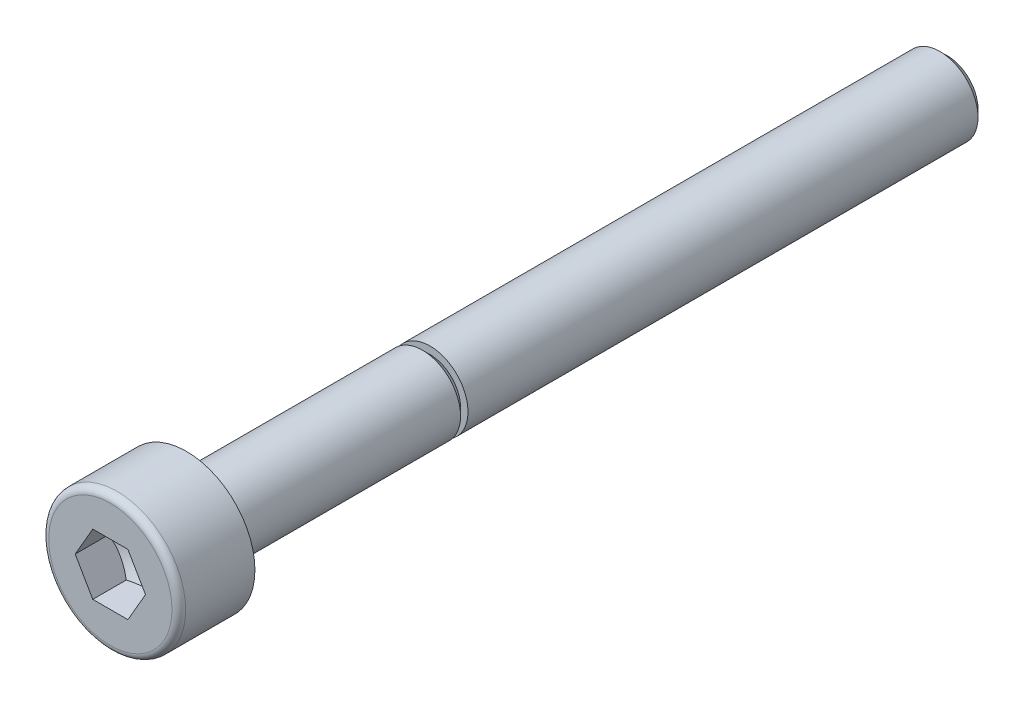
ISO-10303-21;
HEADER;
FILE_DESCRIPTION(('STEP AP214'),'2;1');
FILE_NAME('part.step','',(''),(''),'','','');
FILE_SCHEMA(('AUTOMOTIVE_DESIGN { 1 0 10303 214 1 1 1 1 }'));
ENDSEC;
DATA;
#1=APPLICATION_CONTEXT('core data for automotive mechanical design processes');
#2=APPLICATION_PROTOCOL_DEFINITION('international standard','automotive_design',2000,#1);
#3=PRODUCT_CONTEXT('',#1,'mechanical');
#4=PRODUCT('Part','Part','',(#3));
#5=PRODUCT_RELATED_PRODUCT_CATEGORY('part','',(#4));
#6=PRODUCT_DEFINITION_FORMATION('','',#4);
#7=PRODUCT_DEFINITION_CONTEXT('part definition',#1,'design');
#8=PRODUCT_DEFINITION('design','',#6,#7);
#9=PRODUCT_DEFINITION_SHAPE('','',#8);
#10=(LENGTH_UNIT() NAMED_UNIT(*) SI_UNIT(.MILLI.,.METRE.));
#11=(NAMED_UNIT(*) PLANE_ANGLE_UNIT() SI_UNIT($,.RADIAN.));
#12=(NAMED_UNIT(*) SI_UNIT($,.STERADIAN.) SOLID_ANGLE_UNIT());
#13=UNCERTAINTY_MEASURE_WITH_UNIT(LENGTH_MEASURE(1.E-05),#10,'distance_accuracy_value','');
#14=(GEOMETRIC_REPRESENTATION_CONTEXT(3) GLOBAL_UNCERTAINTY_ASSIGNED_CONTEXT((#13)) GLOBAL_UNIT_ASSIGNED_CONTEXT((#10,
#11,#12)) REPRESENTATION_CONTEXT('',''));
#15=CARTESIAN_POINT('',(0.,0.,0.));
#16=DIRECTION('',(0.,0.,1.));
#17=DIRECTION('',(1.,0.,0.));
#18=AXIS2_PLACEMENT_3D('',#15,#16,#17);
#19=CARTESIAN_POINT('',(0.,2.025,2.5));
#20=DIRECTION('',(0.,0.,-1.));
#21=DIRECTION('',(-1.,0.,0.));
#22=AXIS2_PLACEMENT_3D('',#19,#20,#21);
#23=PLANE('',#22);
#24=CARTESIAN_POINT('',(0.,0.,2.5));
#25=DIRECTION('',(0.,0.,1.));
#26=DIRECTION('',(1.,0.,0.));
#27=AXIS2_PLACEMENT_3D('',#24,#25,#26);
#28=CIRCLE('',#27,2.025);
#29=CARTESIAN_POINT('',(2.025,0.,2.5));
#30=VERTEX_POINT('',#29);
#31=EDGE_CURVE('E137',#30,#30,#28,.T.);
#32=ORIENTED_EDGE('',*,*,#31,.T.);
#33=EDGE_LOOP('',(#32));
#34=FACE_BOUND('',#33,.T.);
#35=DIRECTION('',(0.5,-0.866025403784439,0.));
#36=VECTOR('',#35,1.);
#37=CARTESIAN_POINT('',(0.57735,0.999999533749892,2.5));
#38=LINE('',#37,#36);
#39=CARTESIAN_POINT('',(0.57735,0.999999533749892,2.5));
#40=VERTEX_POINT('',#39);
#41=CARTESIAN_POINT('',(1.1547,0.,2.5));
#42=VERTEX_POINT('',#41);
#43=EDGE_CURVE('E31',#40,#42,#38,.T.);
#44=ORIENTED_EDGE('',*,*,#43,.T.);
#45=DIRECTION('',(-0.5,-0.866025403784439,0.));
#46=VECTOR('',#45,1.);
#47=CARTESIAN_POINT('',(1.1547,0.,2.5));
#48=LINE('',#47,#46);
#49=CARTESIAN_POINT('',(0.57735,-0.999999533749891,2.5));
#50=VERTEX_POINT('',#49);
#51=EDGE_CURVE('E184',#42,#50,#48,.T.);
#52=ORIENTED_EDGE('',*,*,#51,.T.);
#53=DIRECTION('',(-1.,0.,0.));
#54=VECTOR('',#53,1.);
#55=CARTESIAN_POINT('',(0.57735,-0.999999533749891,2.5));
#56=LINE('',#55,#54);
#57=CARTESIAN_POINT('',(-0.57735,-0.999999533749892,2.5));
#58=VERTEX_POINT('',#57);
#59=EDGE_CURVE('E189',#50,#58,#56,.T.);
#60=ORIENTED_EDGE('',*,*,#59,.T.);
#61=DIRECTION('',(-0.5,0.866025403784439,0.));
#62=VECTOR('',#61,1.);
#63=CARTESIAN_POINT('',(-0.57735,-0.999999533749892,2.5));
#64=LINE('',#63,#62);
#65=CARTESIAN_POINT('',(-1.1547,0.,2.5));
#66=VERTEX_POINT('',#65);
#67=EDGE_CURVE('E193',#58,#66,#64,.T.);
#68=ORIENTED_EDGE('',*,*,#67,.T.);
#69=DIRECTION('',(0.5,0.866025403784439,0.));
#70=VECTOR('',#69,1.);
#71=CARTESIAN_POINT('',(-1.1547,0.,2.5));
#72=LINE('',#71,#70);
#73=CARTESIAN_POINT('',(-0.57735,0.999999533749891,2.5));
#74=VERTEX_POINT('',#73);
#75=EDGE_CURVE('E103',#66,#74,#72,.T.);
#76=ORIENTED_EDGE('',*,*,#75,.T.);
#77=DIRECTION('',(1.,0.,0.));
#78=VECTOR('',#77,1.);
#79=CARTESIAN_POINT('',(-0.57735,0.999999533749891,2.5));
#80=LINE('',#79,#78);
#81=EDGE_CURVE('E94',#74,#40,#80,.T.);
#82=ORIENTED_EDGE('',*,*,#81,.T.);
#83=EDGE_LOOP('',(#44,#52,#60,#68,#76,#82));
#84=FACE_BOUND('',#83,.T.);
#85=ADVANCED_FACE('F16',(#34,#84),#23,.F.);
#86=CARTESIAN_POINT('',(0.,0.,0.));
#87=DIRECTION('',(0.,0.,1.));
#88=DIRECTION('',(1.,0.,0.));
#89=AXIS2_PLACEMENT_3D('',#86,#87,#88);
#90=PLANE('',#89);
#91=CARTESIAN_POINT('',(0.,0.,0.));
#92=DIRECTION('',(0.,0.,1.));
#93=DIRECTION('',(1.,0.,0.));
#94=AXIS2_PLACEMENT_3D('',#91,#92,#93);
#95=CIRCLE('',#94,2.25);
#96=CARTESIAN_POINT('',(2.25,0.,0.));
#97=VERTEX_POINT('',#96);
#98=EDGE_CURVE('E24',#97,#97,#95,.T.);
#99=ORIENTED_EDGE('',*,*,#98,.F.);
#100=EDGE_LOOP('',(#99));
#101=FACE_BOUND('',#100,.T.);
#102=CARTESIAN_POINT('',(0.,0.,0.));
#103=DIRECTION('',(0.,0.,1.));
#104=DIRECTION('',(1.,0.,0.));
#105=AXIS2_PLACEMENT_3D('',#102,#103,#104);
#106=CIRCLE('',#105,1.25);
#107=CARTESIAN_POINT('',(1.25,0.,0.));
#108=VERTEX_POINT('',#107);
#109=EDGE_CURVE('E11',#108,#108,#106,.F.);
#110=ORIENTED_EDGE('',*,*,#109,.F.);
#111=EDGE_LOOP('',(#110));
#112=FACE_BOUND('',#111,.T.);
#113=ADVANCED_FACE('F152',(#101,#112),#90,.F.);
#114=CARTESIAN_POINT('',(0.,0.,2.5));
#115=DIRECTION('',(0.,0.,1.));
#116=DIRECTION('',(1.,0.,0.));
#117=AXIS2_PLACEMENT_3D('',#114,#115,#116);
#118=CYLINDRICAL_SURFACE('',#117,2.25);
#119=CARTESIAN_POINT('',(0.,0.,2.275));
#120=DIRECTION('',(0.,0.,1.));
#121=DIRECTION('',(1.,0.,0.));
#122=AXIS2_PLACEMENT_3D('',#119,#120,#121);
#123=CIRCLE('',#122,2.25);
#124=CARTESIAN_POINT('',(2.25,0.,2.275));
#125=VERTEX_POINT('',#124);
#126=EDGE_CURVE('E141',#125,#125,#123,.T.);
#127=ORIENTED_EDGE('',*,*,#126,.F.);
#128=EDGE_LOOP('',(#127));
#129=FACE_BOUND('',#128,.T.);
#130=ORIENTED_EDGE('',*,*,#98,.T.);
#131=EDGE_LOOP('',(#130));
#132=FACE_BOUND('',#131,.T.);
#133=ADVANCED_FACE('F150',(#129,#132),#118,.T.);
#134=CARTESIAN_POINT('',(0.,0.,2.275));
#135=DIRECTION('',(0.,0.,1.));
#136=DIRECTION('',(1.,0.,0.));
#137=AXIS2_PLACEMENT_3D('',#134,#135,#136);
#138=TOROIDAL_SURFACE('',#137,2.025,0.225);
#139=ORIENTED_EDGE('',*,*,#31,.F.);
#140=EDGE_LOOP('',(#139));
#141=FACE_BOUND('',#140,.T.);
#142=ORIENTED_EDGE('',*,*,#126,.T.);
#143=EDGE_LOOP('',(#142));
#144=FACE_BOUND('',#143,.T.);
#145=ADVANCED_FACE('F160',(#141,#144),#138,.T.);
#146=CARTESIAN_POINT('',(0.,0.,0.));
#147=DIRECTION('',(0.,0.,1.));
#148=DIRECTION('',(1.,0.,0.));
#149=AXIS2_PLACEMENT_3D('',#146,#147,#148);
#150=CYLINDRICAL_SURFACE('',#149,1.25);
#151=CARTESIAN_POINT('',(0.,0.,-7.7564375));
#152=DIRECTION('',(0.,0.,1.));
#153=DIRECTION('',(1.,0.,0.));
#154=AXIS2_PLACEMENT_3D('',#151,#152,#153);
#155=CIRCLE('',#154,1.25);
#156=CARTESIAN_POINT('',(1.25,0.,-7.7564375));
#157=VERTEX_POINT('',#156);
#158=EDGE_CURVE('E117',#157,#157,#155,.T.);
#159=ORIENTED_EDGE('',*,*,#158,.T.);
#160=EDGE_LOOP('',(#159));
#161=FACE_BOUND('',#160,.T.);
#162=ORIENTED_EDGE('',*,*,#109,.T.);
#163=EDGE_LOOP('',(#162));
#164=FACE_BOUND('',#163,.T.);
#165=ADVANCED_FACE('F157',(#161,#164),#150,.T.);
#166=CARTESIAN_POINT('',(0.,0.,-25.));
#167=DIRECTION('',(0.,0.,1.));
#168=DIRECTION('',(1.,0.,0.));
#169=AXIS2_PLACEMENT_3D('',#166,#167,#168);
#170=PLANE('',#169);
#171=CARTESIAN_POINT('',(0.,0.,-25.));
#172=DIRECTION('',(0.,0.,1.));
#173=DIRECTION('',(1.,0.,0.));
#174=AXIS2_PLACEMENT_3D('',#171,#172,#173);
#175=CIRCLE('',#174,1.0064375);
#176=CARTESIAN_POINT('',(1.0064375,0.,-25.));
#177=VERTEX_POINT('',#176);
#178=EDGE_CURVE('E133',#177,#177,#175,.T.);
#179=ORIENTED_EDGE('',*,*,#178,.F.);
#180=EDGE_LOOP('',(#179));
#181=FACE_BOUND('',#180,.T.);
#182=ADVANCED_FACE('F159',(#181),#170,.F.);
#183=CARTESIAN_POINT('',(0.,0.,-25.));
#184=DIRECTION('',(0.,0.,1.));
#185=DIRECTION('',(1.,0.,0.));
#186=AXIS2_PLACEMENT_3D('',#183,#184,#185);
#187=CONICAL_SURFACE('',#186,1.0064375,0.78539816339745);
#188=CARTESIAN_POINT('',(0.,0.,-24.7564375));
#189=DIRECTION('',(0.,0.,1.));
#190=DIRECTION('',(1.,0.,0.));
#191=AXIS2_PLACEMENT_3D('',#188,#189,#190);
#192=CIRCLE('',#191,1.25);
#193=CARTESIAN_POINT('',(1.25,0.,-24.7564375));
#194=VERTEX_POINT('',#193);
#195=EDGE_CURVE('E129',#194,#194,#192,.T.);
#196=ORIENTED_EDGE('',*,*,#195,.F.);
#197=EDGE_LOOP('',(#196));
#198=FACE_BOUND('',#197,.T.);
#199=ORIENTED_EDGE('',*,*,#178,.T.);
#200=EDGE_LOOP('',(#199));
#201=FACE_BOUND('',#200,.T.);
#202=ADVANCED_FACE('F168',(#198,#201),#187,.T.);
#203=CARTESIAN_POINT('',(0.,0.,0.));
#204=DIRECTION('',(0.,0.,1.));
#205=DIRECTION('',(1.,0.,0.));
#206=AXIS2_PLACEMENT_3D('',#203,#204,#205);
#207=CYLINDRICAL_SURFACE('',#206,1.25);
#208=CARTESIAN_POINT('',(0.,0.,-8.));
#209=DIRECTION('',(0.,0.,1.));
#210=DIRECTION('',(1.,0.,0.));
#211=AXIS2_PLACEMENT_3D('',#208,#209,#210);
#212=CIRCLE('',#211,1.25);
#213=CARTESIAN_POINT('',(1.25,0.,-8.));
#214=VERTEX_POINT('',#213);
#215=EDGE_CURVE('E125',#214,#214,#212,.T.);
#216=ORIENTED_EDGE('',*,*,#215,.F.);
#217=EDGE_LOOP('',(#216));
#218=FACE_BOUND('',#217,.T.);
#219=ORIENTED_EDGE('',*,*,#195,.T.);
#220=EDGE_LOOP('',(#219));
#221=FACE_BOUND('',#220,.T.);
#222=ADVANCED_FACE('F329',(#218,#221),#207,.T.);
#223=CARTESIAN_POINT('',(0.,1.25,-8.));
#224=DIRECTION('',(0.,0.,-1.));
#225=DIRECTION('',(-1.,0.,0.));
#226=AXIS2_PLACEMENT_3D('',#223,#224,#225);
#227=PLANE('',#226);
#228=CARTESIAN_POINT('',(0.,0.,-8.));
#229=DIRECTION('',(0.,0.,1.));
#230=DIRECTION('',(1.,0.,0.));
#231=AXIS2_PLACEMENT_3D('',#228,#229,#230);
#232=CIRCLE('',#231,1.0064375);
#233=CARTESIAN_POINT('',(1.0064375,0.,-8.));
#234=VERTEX_POINT('',#233);
#235=EDGE_CURVE('E121',#234,#234,#232,.T.);
#236=ORIENTED_EDGE('',*,*,#235,.F.);
#237=EDGE_LOOP('',(#236));
#238=FACE_BOUND('',#237,.T.);
#239=ORIENTED_EDGE('',*,*,#215,.T.);
#240=EDGE_LOOP('',(#239));
#241=FACE_BOUND('',#240,.T.);
#242=ADVANCED_FACE('F321',(#238,#241),#227,.F.);
#243=CARTESIAN_POINT('',(0.,0.,-8.));
#244=DIRECTION('',(0.,0.,1.));
#245=DIRECTION('',(1.,0.,0.));
#246=AXIS2_PLACEMENT_3D('',#243,#244,#245);
#247=CONICAL_SURFACE('',#246,1.0064375,0.785398163397449);
#248=ORIENTED_EDGE('',*,*,#158,.F.);
#249=EDGE_LOOP('',(#248));
#250=FACE_BOUND('',#249,.T.);
#251=ORIENTED_EDGE('',*,*,#235,.T.);
#252=EDGE_LOOP('',(#251));
#253=FACE_BOUND('',#252,.T.);
#254=ADVANCED_FACE('F314',(#250,#253),#247,.T.);
#255=CARTESIAN_POINT('',(0.57735,0.999999533749892,0.733333644166739));
#256=DIRECTION('',(-0.866025403784439,-0.5,0.));
#257=DIRECTION('',(-0.5,0.866025403784439,0.));
#258=AXIS2_PLACEMENT_3D('',#255,#256,#257);
#259=PLANE('',#258);
#260=DIRECTION('',(0.,0.,1.));
#261=VECTOR('',#260,1.);
#262=CARTESIAN_POINT('',(1.1547,0.,0.733333644166739));
#263=LINE('',#262,#261);
#264=CARTESIAN_POINT('',(1.1547,0.,1.4));
#265=VERTEX_POINT('',#264);
#266=EDGE_CURVE('E115',#265,#42,#263,.T.);
#267=ORIENTED_EDGE('',*,*,#266,.T.);
#268=ORIENTED_EDGE('',*,*,#43,.F.);
#269=DIRECTION('',(0.,0.,1.));
#270=VECTOR('',#269,1.);
#271=CARTESIAN_POINT('',(0.57735,0.999999533749892,0.733333644166739));
#272=LINE('',#271,#270);
#273=CARTESIAN_POINT('',(0.57735,0.999999533749892,1.4));
#274=VERTEX_POINT('',#273);
#275=EDGE_CURVE('E87',#274,#40,#272,.T.);
#276=ORIENTED_EDGE('',*,*,#275,.F.);
#277=CARTESIAN_POINT('',(1.15470115470054,-2.E-06,1.40000066666767));
#278=CARTESIAN_POINT('',(1.12933009927234,0.0439419570432812,1.38534839130548));
#279=CARTESIAN_POINT('',(1.10374004129754,0.088265237624272,1.37202290534354));
#280=CARTESIAN_POINT('',(1.05211684902319,0.17767922949234,1.34876365062444));
#281=CARTESIAN_POINT('',(1.02608279776624,0.22277152899623,1.33883810924503));
#282=CARTESIAN_POINT('',(0.974337322784001,0.312397320727257,1.32338826224283));
#283=CARTESIAN_POINT('',(0.948633858612371,0.356917026603045,1.31776111778143));
#284=CARTESIAN_POINT('',(0.897106047785879,0.446165812957328,1.31104469248615));
#285=CARTESIAN_POINT('',(0.871281888296732,0.490894569255293,1.30994984858515));
#286=CARTESIAN_POINT('',(0.823032064442526,0.574465715627026,1.31223310501152));
#287=CARTESIAN_POINT('',(0.800599160429648,0.613320645138646,1.3150505901439));
#288=CARTESIAN_POINT('',(0.755879495715112,0.690777376521668,1.32397862379728));
#289=CARTESIAN_POINT('',(0.733592889575673,0.729378910683452,1.33009221924117));
#290=CARTESIAN_POINT('',(0.688781095362013,0.806995215039832,1.34537505021915));
#291=CARTESIAN_POINT('',(0.666261576071427,0.846000166613155,1.3546090395603));
#292=CARTESIAN_POINT('',(0.621558322302024,0.923428473405406,1.3755663014077));
#293=CARTESIAN_POINT('',(0.599374015548132,0.961852819833839,1.38728465283382));
#294=CARTESIAN_POINT('',(0.577348845299461,1.00000153374989,1.40000066666767));
#295=B_SPLINE_CURVE_WITH_KNOTS('',3,(#277,#278,#279,#280,#281,#282,#283,#284,#285,#286,#287,
#288,#289,#290,#291,#292,#293,#294),.UNSPECIFIED.,.F.,.F.,(4,2,2,2,2,2,2,2,4),(0.,
0.158508089994533,0.317397081098293,0.472354046423629,0.627120756921706,0.76185516297255,
0.896714331530991,1.0345640617321,1.17214324556804),.UNSPECIFIED.);
#296=EDGE_CURVE('E79',#265,#274,#295,.T.);
#297=ORIENTED_EDGE('',*,*,#296,.F.);
#298=EDGE_LOOP('',(#267,#268,#276,#297));
#299=FACE_BOUND('',#298,.T.);
#300=ADVANCED_FACE('F88',(#299),#259,.T.);
#301=CARTESIAN_POINT('',(1.1547,0.,0.733333644166739));
#302=DIRECTION('',(-0.866025403784439,0.5,0.));
#303=DIRECTION('',(0.5,0.866025403784439,0.));
#304=AXIS2_PLACEMENT_3D('',#301,#302,#303);
#305=PLANE('',#304);
#306=DIRECTION('',(0.,0.,1.));
#307=VECTOR('',#306,1.);
#308=CARTESIAN_POINT('',(0.57735,-0.999999533749891,0.733333644166739));
#309=LINE('',#308,#307);
#310=CARTESIAN_POINT('',(0.57735,-0.999999533749891,1.4));
#311=VERTEX_POINT('',#310);
#312=EDGE_CURVE('E112',#311,#50,#309,.T.);
#313=ORIENTED_EDGE('',*,*,#312,.T.);
#314=ORIENTED_EDGE('',*,*,#51,.F.);
#315=ORIENTED_EDGE('',*,*,#266,.F.);
#316=CARTESIAN_POINT('',(0.577348845299462,-1.00000153374989,1.40000066666767));
#317=CARTESIAN_POINT('',(0.602719900727658,-0.956057576706609,1.38534839130548));
#318=CARTESIAN_POINT('',(0.628309958702461,-0.911734296125618,1.37202290534353));
#319=CARTESIAN_POINT('',(0.679933150976809,-0.82232030425755,1.34876365062444));
#320=CARTESIAN_POINT('',(0.705967202233759,-0.77722800475366,1.33883810924503));
#321=CARTESIAN_POINT('',(0.757712677216,-0.687602213022634,1.32338826224283));
#322=CARTESIAN_POINT('',(0.78341614138763,-0.643082507146845,1.31776111778143));
#323=CARTESIAN_POINT('',(0.834943952214122,-0.553833720792562,1.31104469248615));
#324=CARTESIAN_POINT('',(0.860768111703269,-0.509104964494598,1.30994984858515));
#325=CARTESIAN_POINT('',(0.909017935557475,-0.425533818122865,1.31223310501152));
#326=CARTESIAN_POINT('',(0.931450839570352,-0.386678888611245,1.3150505901439));
#327=CARTESIAN_POINT('',(0.976170504284888,-0.309222157228223,1.32397862379728));
#328=CARTESIAN_POINT('',(0.998457110424327,-0.27062062306644,1.33009221924117));
#329=CARTESIAN_POINT('',(1.04326890463799,-0.193004318710059,1.34537505021915));
#330=CARTESIAN_POINT('',(1.06578842392857,-0.153999367136737,1.3546090395603));
#331=CARTESIAN_POINT('',(1.11049167769798,-0.0765710603444861,1.3755663014077));
#332=CARTESIAN_POINT('',(1.13267598445187,-0.038146713916053,1.38728465283382));
#333=CARTESIAN_POINT('',(1.15470115470054,1.99999999979549E-06,1.40000066666767));
#334=B_SPLINE_CURVE_WITH_KNOTS('',3,(#316,#317,#318,#319,#320,#321,#322,#323,#324,#325,#326,
#327,#328,#329,#330,#331,#332,#333),.UNSPECIFIED.,.F.,.F.,(4,2,2,2,2,2,2,2,4),(0.,
0.158508089994533,0.317397081098292,0.472354046423629,0.627120756921705,0.761855162972548,
0.896714331530989,1.0345640617321,1.17214324556804),.UNSPECIFIED.);
#335=EDGE_CURVE('E83',#311,#265,#334,.T.);
#336=ORIENTED_EDGE('',*,*,#335,.F.);
#337=EDGE_LOOP('',(#313,#314,#315,#336));
#338=FACE_BOUND('',#337,.T.);
#339=ADVANCED_FACE('F249',(#338),#305,.T.);
#340=CARTESIAN_POINT('',(0.57735,-0.999999533749891,0.733333644166739));
#341=DIRECTION('',(0.,1.,0.));
#342=DIRECTION('',(1.,0.,0.));
#343=AXIS2_PLACEMENT_3D('',#340,#341,#342);
#344=PLANE('',#343);
#345=DIRECTION('',(0.,0.,1.));
#346=VECTOR('',#345,1.);
#347=CARTESIAN_POINT('',(-0.57735,-0.999999533749892,0.733333644166739));
#348=LINE('',#347,#346);
#349=CARTESIAN_POINT('',(-0.57735,-0.999999533749891,1.4));
#350=VERTEX_POINT('',#349);
#351=EDGE_CURVE('E109',#350,#58,#348,.T.);
#352=ORIENTED_EDGE('',*,*,#351,.T.);
#353=ORIENTED_EDGE('',*,*,#59,.F.);
#354=ORIENTED_EDGE('',*,*,#312,.F.);
#355=CARTESIAN_POINT('',(-1.49514442485991,-0.999999533749892,1.7718351156293));
#356=CARTESIAN_POINT('',(-1.45196058536606,-0.999999533749892,1.75111485765462));
#357=CARTESIAN_POINT('',(-1.40867216909359,-0.999999533749891,1.73061351907318));
#358=CARTESIAN_POINT('',(-1.32182886600433,-0.999999533749891,1.69016329969704));
#359=CARTESIAN_POINT('',(-1.2782739329316,-0.999999533749891,1.67021451832587));
#360=CARTESIAN_POINT('',(-1.14662287013031,-0.999999533749891,1.61114505895246));
#361=CARTESIAN_POINT('',(-1.05805675536899,-0.999999533749892,1.57305244890367));
#362=CARTESIAN_POINT('',(-0.876832601569535,-0.999999533749891,1.5002457766915));
#363=CARTESIAN_POINT('',(-0.784128092285834,-0.999999533749891,1.46564581189097));
#364=CARTESIAN_POINT('',(-0.596331471486309,-0.999999533749891,1.40407347276848));
#365=CARTESIAN_POINT('',(-0.501246273385448,-0.999999533749892,1.3770812958721));
#366=CARTESIAN_POINT('',(-0.356699820153757,-0.999999533749892,1.34577579531848));
#367=CARTESIAN_POINT('',(-0.308244019411517,-0.999999533749891,1.33687512797059));
#368=CARTESIAN_POINT('',(-0.210788772252078,-0.999999533749891,1.32274246775701));
#369=CARTESIAN_POINT('',(-0.161789362800289,-0.999999533749891,1.31751022697272));
#370=CARTESIAN_POINT('',(-0.0641060187969573,-0.999999533749891,1.31119902237348));
#371=CARTESIAN_POINT('',(-0.0154253386130913,-0.999999533749891,1.31007104693763));
#372=CARTESIAN_POINT('',(0.0818553185508148,-0.999999533749891,1.31193301938144));
#373=CARTESIAN_POINT('',(0.130455290347174,-0.999999533749891,1.31492322224215));
#374=CARTESIAN_POINT('',(0.250369475163949,-0.999999533749891,1.32711835595496));
#375=CARTESIAN_POINT('',(0.321451773511317,-0.999999533749891,1.33860859031067));
#376=CARTESIAN_POINT('',(0.462228831139482,-0.999999533749891,1.36824033412323));
#377=CARTESIAN_POINT('',(0.531921810918687,-0.999999533749891,1.3863898599668));
#378=CARTESIAN_POINT('',(0.671415426701005,-0.999999533749891,1.42786971297303));
#379=CARTESIAN_POINT('',(0.741183391837659,-0.999999533749891,1.45130714724549));
#380=CARTESIAN_POINT('',(0.879437913589632,-0.999999533749891,1.50156444247616));
#381=CARTESIAN_POINT('',(0.947924910374634,-0.999999533749891,1.52838311609825));
#382=CARTESIAN_POINT('',(1.12214344819038,-0.999999533749891,1.60005333402631));
#383=CARTESIAN_POINT('',(1.22718281828392,-0.999999533749891,1.64657115146741));
#384=CARTESIAN_POINT('',(1.43575436261154,-0.999999533749891,1.74287457009603));
#385=CARTESIAN_POINT('',(1.53928614185372,-0.999999533749891,1.79266100949593));
#386=CARTESIAN_POINT('',(1.74545816034081,-0.999999533749891,1.89433218680171));
#387=CARTESIAN_POINT('',(1.84809723800399,-0.999999533749891,1.94621927083694));
#388=CARTESIAN_POINT('',(2.05268820074271,-0.999999533749891,2.05133213897694));
#389=CARTESIAN_POINT('',(2.15464006298767,-0.999999533749891,2.10455796728207));
#390=CARTESIAN_POINT('',(2.34844987211842,-0.999999533749891,2.20685880508856));
#391=CARTESIAN_POINT('',(2.4403516275912,-0.999999533749891,2.25585099769028));
#392=CARTESIAN_POINT('',(2.62385949655876,-0.999999533749891,2.35439337097659));
#393=CARTESIAN_POINT('',(2.71546559895035,-0.999999533749891,2.40394357231047));
#394=CARTESIAN_POINT('',(2.89821733508573,-0.999999533749891,2.50333569467086));
#395=CARTESIAN_POINT('',(2.98936354739567,-0.99999953374989,2.55317655314389));
#396=CARTESIAN_POINT('',(3.17147169543988,-0.99999953374989,2.65318266354378));
#397=CARTESIAN_POINT('',(3.26243364056806,-0.999999533749891,2.70334789835804));
#398=CARTESIAN_POINT('',(3.35332938008973,-0.999999533749891,2.75363205437524));
#399=B_SPLINE_CURVE_WITH_KNOTS('',3,(#355,#356,#357,#358,#359,#360,#361,#362,#363,#364,#365,
#366,#367,#368,#369,#370,#371,#372,#373,#374,#375,#376,#377,#378,#379,#380,#381,#382,#383,#384,
#385,#386,#387,#388,#389,#390,#391,#392,#393,#394,#395,#396,#397,#398),.UNSPECIFIED.,.F.,.F.,(4,
2,2,2,2,2,2,2,2,2,2,2,2,2,2,2,2,2,2,2,2,4),(0.,0.143690272658494,0.287406234227527,
0.576560055393513,0.873259077741897,1.16917852539457,1.31686277501978,1.46453704292645,
1.6104419422712,1.75635587586723,1.9719244208457,2.1877533209983,2.40842488718949,
2.62901917835835,2.97354524236226,3.31816000509865,3.66317088870179,4.0081931782759,
4.32062550425272,4.63306943012528,4.94471865214482,5.25635156499875),.UNSPECIFIED.);
#400=EDGE_CURVE('E237',#350,#311,#399,.T.);
#401=ORIENTED_EDGE('',*,*,#400,.F.);
#402=EDGE_LOOP('',(#352,#353,#354,#401));
#403=FACE_BOUND('',#402,.T.);
#404=ADVANCED_FACE('F244',(#403),#344,.T.);
#405=CARTESIAN_POINT('',(-0.57735,-0.999999533749892,0.733333644166739));
#406=DIRECTION('',(0.866025403784439,0.5,0.));
#407=DIRECTION('',(0.5,-0.866025403784439,0.));
#408=AXIS2_PLACEMENT_3D('',#405,#406,#407);
#409=PLANE('',#408);
#410=DIRECTION('',(0.,0.,1.));
#411=VECTOR('',#410,1.);
#412=CARTESIAN_POINT('',(-1.1547,0.,0.733333644166739));
#413=LINE('',#412,#411);
#414=CARTESIAN_POINT('',(-1.1547,0.,1.4));
#415=VERTEX_POINT('',#414);
#416=EDGE_CURVE('E100',#415,#66,#413,.T.);
#417=ORIENTED_EDGE('',*,*,#416,.T.);
#418=ORIENTED_EDGE('',*,*,#67,.F.);
#419=ORIENTED_EDGE('',*,*,#351,.F.);
#420=CARTESIAN_POINT('',(-1.15470115470054,1.99999999967975E-06,1.40000066666767));
#421=CARTESIAN_POINT('',(-1.12933009927234,-0.0439419570432814,1.38534839130548));
#422=CARTESIAN_POINT('',(-1.10374004129754,-0.0882652376242723,1.37202290534353));
#423=CARTESIAN_POINT('',(-1.05211684902319,-0.17767922949234,1.34876365062444));
#424=CARTESIAN_POINT('',(-1.02608279776624,-0.22277152899623,1.33883810924503));
#425=CARTESIAN_POINT('',(-0.974337322784001,-0.312397320727257,1.32338826224283));
#426=CARTESIAN_POINT('',(-0.948633858612371,-0.356917026603046,1.31776111778143));
#427=CARTESIAN_POINT('',(-0.897106047785878,-0.446165812957328,1.31104469248615));
#428=CARTESIAN_POINT('',(-0.871281888296731,-0.490894569255292,1.30994984858515));
#429=CARTESIAN_POINT('',(-0.823032064442525,-0.574465715627026,1.31223310501152));
#430=CARTESIAN_POINT('',(-0.800599160429648,-0.613320645138646,1.3150505901439));
#431=CARTESIAN_POINT('',(-0.755879495715112,-0.690777376521668,1.32397862379728));
#432=CARTESIAN_POINT('',(-0.733592889575673,-0.729378910683452,1.33009221924117));
#433=CARTESIAN_POINT('',(-0.688781095362013,-0.806995215039833,1.34537505021915));
#434=CARTESIAN_POINT('',(-0.666261576071427,-0.846000166613155,1.3546090395603));
#435=CARTESIAN_POINT('',(-0.621558322302024,-0.923428473405406,1.3755663014077));
#436=CARTESIAN_POINT('',(-0.599374015548133,-0.961852819833839,1.38728465283382));
#437=CARTESIAN_POINT('',(-0.577348845299461,-1.00000153374989,1.40000066666767));
#438=B_SPLINE_CURVE_WITH_KNOTS('',3,(#420,#421,#422,#423,#424,#425,#426,#427,#428,#429,#430,
#431,#432,#433,#434,#435,#436,#437),.UNSPECIFIED.,.F.,.F.,(4,2,2,2,2,2,2,2,4),(0.,
0.158508089994533,0.317397081098293,0.472354046423629,0.627120756921707,0.76185516297255,
0.896714331530991,1.0345640617321,1.17214324556804),.UNSPECIFIED.);
#439=EDGE_CURVE('E230',#415,#350,#438,.T.);
#440=ORIENTED_EDGE('',*,*,#439,.F.);
#441=EDGE_LOOP('',(#417,#418,#419,#440));
#442=FACE_BOUND('',#441,.T.);
#443=ADVANCED_FACE('F213',(#442),#409,.T.);
#444=CARTESIAN_POINT('',(-1.1547,0.,0.733333644166739));
#445=DIRECTION('',(0.866025403784439,-0.5,0.));
#446=DIRECTION('',(-0.5,-0.866025403784439,0.));
#447=AXIS2_PLACEMENT_3D('',#444,#445,#446);
#448=PLANE('',#447);
#449=DIRECTION('',(0.,0.,1.));
#450=VECTOR('',#449,1.);
#451=CARTESIAN_POINT('',(-0.57735,0.999999533749891,0.733333644166739));
#452=LINE('',#451,#450);
#453=CARTESIAN_POINT('',(-0.57735,0.999999533749891,1.4));
#454=VERTEX_POINT('',#453);
#455=EDGE_CURVE('E93',#454,#74,#452,.T.);
#456=ORIENTED_EDGE('',*,*,#455,.T.);
#457=ORIENTED_EDGE('',*,*,#75,.F.);
#458=ORIENTED_EDGE('',*,*,#416,.F.);
#459=CARTESIAN_POINT('',(-0.577348845299462,1.00000153374989,1.40000066666767));
#460=CARTESIAN_POINT('',(-0.602719900727658,0.956057576706609,1.38534839130548));
#461=CARTESIAN_POINT('',(-0.628309958702461,0.911734296125618,1.37202290534353));
#462=CARTESIAN_POINT('',(-0.679933150976809,0.82232030425755,1.34876365062444));
#463=CARTESIAN_POINT('',(-0.705967202233759,0.77722800475366,1.33883810924503));
#464=CARTESIAN_POINT('',(-0.757712677216,0.687602213022634,1.32338826224283));
#465=CARTESIAN_POINT('',(-0.783416141387629,0.643082507146845,1.31776111778143));
#466=CARTESIAN_POINT('',(-0.834943952214122,0.553833720792562,1.31104469248615));
#467=CARTESIAN_POINT('',(-0.860768111703269,0.509104964494599,1.30994984858515));
#468=CARTESIAN_POINT('',(-0.909017935557475,0.425533818122865,1.31223310501152));
#469=CARTESIAN_POINT('',(-0.931450839570352,0.386678888611245,1.3150505901439));
#470=CARTESIAN_POINT('',(-0.976170504284889,0.309222157228223,1.32397862379728));
#471=CARTESIAN_POINT('',(-0.998457110424327,0.270620623066439,1.33009221924117));
#472=CARTESIAN_POINT('',(-1.04326890463799,0.193004318710059,1.34537505021915));
#473=CARTESIAN_POINT('',(-1.06578842392857,0.153999367136736,1.3546090395603));
#474=CARTESIAN_POINT('',(-1.11049167769798,0.0765710603444852,1.3755663014077));
#475=CARTESIAN_POINT('',(-1.13267598445187,0.0381467139160522,1.38728465283382));
#476=CARTESIAN_POINT('',(-1.15470115470054,-2.00000000022229E-06,1.40000066666767));
#477=B_SPLINE_CURVE_WITH_KNOTS('',3,(#459,#460,#461,#462,#463,#464,#465,#466,#467,#468,#469,
#470,#471,#472,#473,#474,#475,#476),.UNSPECIFIED.,.F.,.F.,(4,2,2,2,2,2,2,2,4),(0.,
0.158508089994532,0.317397081098292,0.472354046423628,0.627120756921705,0.761855162972549,
0.896714331530989,1.0345640617321,1.17214324556804),.UNSPECIFIED.);
#478=EDGE_CURVE('E39',#454,#415,#477,.T.);
#479=ORIENTED_EDGE('',*,*,#478,.F.);
#480=EDGE_LOOP('',(#456,#457,#458,#479));
#481=FACE_BOUND('',#480,.T.);
#482=ADVANCED_FACE('F207',(#481),#448,.T.);
#483=CARTESIAN_POINT('',(-0.57735,0.999999533749891,0.733333644166739));
#484=DIRECTION('',(0.,-1.,0.));
#485=DIRECTION('',(-1.,0.,0.));
#486=AXIS2_PLACEMENT_3D('',#483,#484,#485);
#487=PLANE('',#486);
#488=ORIENTED_EDGE('',*,*,#275,.T.);
#489=ORIENTED_EDGE('',*,*,#81,.F.);
#490=ORIENTED_EDGE('',*,*,#455,.F.);
#491=CARTESIAN_POINT('',(-1.49514442485992,0.999999533749891,1.7718351156293));
#492=CARTESIAN_POINT('',(-1.45196058536606,0.999999533749891,1.75111485765463));
#493=CARTESIAN_POINT('',(-1.40867216909359,0.999999533749891,1.73061351907319));
#494=CARTESIAN_POINT('',(-1.32182886600434,0.999999533749891,1.69016329969704));
#495=CARTESIAN_POINT('',(-1.2782739329316,0.999999533749891,1.67021451832587));
#496=CARTESIAN_POINT('',(-1.14662287013032,0.999999533749891,1.61114505895246));
#497=CARTESIAN_POINT('',(-1.05805675536899,0.999999533749891,1.57305244890367));
#498=CARTESIAN_POINT('',(-0.876832601569536,0.999999533749891,1.5002457766915));
#499=CARTESIAN_POINT('',(-0.784128092285834,0.999999533749891,1.46564581189097));
#500=CARTESIAN_POINT('',(-0.596331471486309,0.999999533749891,1.40407347276848));
#501=CARTESIAN_POINT('',(-0.501246273385448,0.999999533749891,1.3770812958721));
#502=CARTESIAN_POINT('',(-0.356699820153758,0.999999533749891,1.34577579531848));
#503=CARTESIAN_POINT('',(-0.308244019411517,0.999999533749891,1.33687512797059));
#504=CARTESIAN_POINT('',(-0.210788772252078,0.999999533749891,1.32274246775701));
#505=CARTESIAN_POINT('',(-0.161789362800289,0.999999533749891,1.31751022697272));
#506=CARTESIAN_POINT('',(-0.0641060187969579,0.999999533749891,1.31119902237348));
#507=CARTESIAN_POINT('',(-0.015425338613092,0.999999533749891,1.31007104693763));
#508=CARTESIAN_POINT('',(0.081855318550814,0.999999533749891,1.31193301938144));
#509=CARTESIAN_POINT('',(0.130455290347173,0.999999533749892,1.31492322224215));
#510=CARTESIAN_POINT('',(0.250369475163948,0.999999533749892,1.32711835595496));
#511=CARTESIAN_POINT('',(0.321451773511316,0.999999533749892,1.33860859031067));
#512=CARTESIAN_POINT('',(0.462228831139482,0.999999533749891,1.36824033412323));
#513=CARTESIAN_POINT('',(0.531921810918687,0.999999533749892,1.3863898599668));
#514=CARTESIAN_POINT('',(0.671415426701005,0.999999533749892,1.42786971297304));
#515=CARTESIAN_POINT('',(0.741183391837658,0.999999533749892,1.45130714724549));
#516=CARTESIAN_POINT('',(0.879437913589632,0.999999533749892,1.50156444247616));
#517=CARTESIAN_POINT('',(0.947924910374634,0.999999533749892,1.52838311609825));
#518=CARTESIAN_POINT('',(1.12214344819038,0.999999533749892,1.60005333402631));
#519=CARTESIAN_POINT('',(1.22718281828392,0.999999533749892,1.64657115146741));
#520=CARTESIAN_POINT('',(1.43575436261154,0.999999533749892,1.74287457009603));
#521=CARTESIAN_POINT('',(1.53928614185372,0.999999533749892,1.79266100949593));
#522=CARTESIAN_POINT('',(1.74545816034081,0.999999533749892,1.89433218680171));
#523=CARTESIAN_POINT('',(1.84809723800399,0.999999533749892,1.94621927083694));
#524=CARTESIAN_POINT('',(2.05268820074271,0.999999533749892,2.05133213897694));
#525=CARTESIAN_POINT('',(2.15464006298767,0.999999533749892,2.10455796728207));
#526=CARTESIAN_POINT('',(2.34844987211842,0.999999533749892,2.20685880508856));
#527=CARTESIAN_POINT('',(2.4403516275912,0.999999533749892,2.25585099769028));
#528=CARTESIAN_POINT('',(2.62385949655876,0.999999533749892,2.35439337097659));
#529=CARTESIAN_POINT('',(2.71546559895035,0.999999533749893,2.40394357231047));
#530=CARTESIAN_POINT('',(2.89821733508573,0.999999533749893,2.50333569467086));
#531=CARTESIAN_POINT('',(2.98936354739567,0.999999533749893,2.55317655314389));
#532=CARTESIAN_POINT('',(3.17147169543988,0.999999533749893,2.65318266354378));
#533=CARTESIAN_POINT('',(3.26243364056806,0.999999533749893,2.70334789835804));
#534=CARTESIAN_POINT('',(3.35332938008973,0.999999533749893,2.75363205437524));
#535=B_SPLINE_CURVE_WITH_KNOTS('',3,(#491,#492,#493,#494,#495,#496,#497,#498,#499,#500,#501,
#502,#503,#504,#505,#506,#507,#508,#509,#510,#511,#512,#513,#514,#515,#516,#517,#518,#519,#520,
#521,#522,#523,#524,#525,#526,#527,#528,#529,#530,#531,#532,#533,#534),.UNSPECIFIED.,.F.,.F.,(4,
2,2,2,2,2,2,2,2,2,2,2,2,2,2,2,2,2,2,2,2,4),(0.,0.143690272658494,0.287406234227528,
0.576560055393514,0.873259077741899,1.16917852539457,1.31686277501978,1.46453704292645,
1.6104419422712,1.75635587586723,1.9719244208457,2.1877533209983,2.40842488718949,
2.62901917835835,2.97354524236226,3.31816000509865,3.66317088870179,4.0081931782759,
4.32062550425272,4.63306943012528,4.94471865214482,5.25635156499876),.UNSPECIFIED.);
#536=EDGE_CURVE('E80',#274,#454,#535,.F.);
#537=ORIENTED_EDGE('',*,*,#536,.F.);
#538=EDGE_LOOP('',(#488,#489,#490,#537));
#539=FACE_BOUND('',#538,.T.);
#540=ADVANCED_FACE('F75',(#539),#487,.T.);
#541=CARTESIAN_POINT('',(0.,0.,0.733333644166739));
#542=DIRECTION('',(0.,0.,1.));
#543=DIRECTION('',(1.,0.,0.));
#544=AXIS2_PLACEMENT_3D('',#541,#542,#543);
#545=CONICAL_SURFACE('',#544,0.,1.0471975511966);
#546=CARTESIAN_POINT('',(0.,0.,0.733333644166739));
#547=VERTEX_POINT('',#546);
#548=VERTEX_LOOP('',#547);
#549=FACE_BOUND('',#548,.T.);
#550=ORIENTED_EDGE('',*,*,#296,.T.);
#551=ORIENTED_EDGE('',*,*,#536,.T.);
#552=ORIENTED_EDGE('',*,*,#478,.T.);
#553=ORIENTED_EDGE('',*,*,#439,.T.);
#554=ORIENTED_EDGE('',*,*,#400,.T.);
#555=ORIENTED_EDGE('',*,*,#335,.T.);
#556=EDGE_LOOP('',(#550,#551,#552,#553,#554,#555));
#557=FACE_BOUND('',#556,.T.);
#558=ADVANCED_FACE('F72',(#549,#557),#545,.F.);
#559=CLOSED_SHELL('',(#85,#113,#133,#145,#165,#182,#202,#222,#242,#254,#300,#339,#404,#443,#482,
#540,#558));
#560=MANIFOLD_SOLID_BREP('B1',#559);
#561=ADVANCED_BREP_SHAPE_REPRESENTATION('',(#18,#560),#14);
#562=SHAPE_DEFINITION_REPRESENTATION(#9,#561);
ENDSEC;
END-ISO-10303-21;
